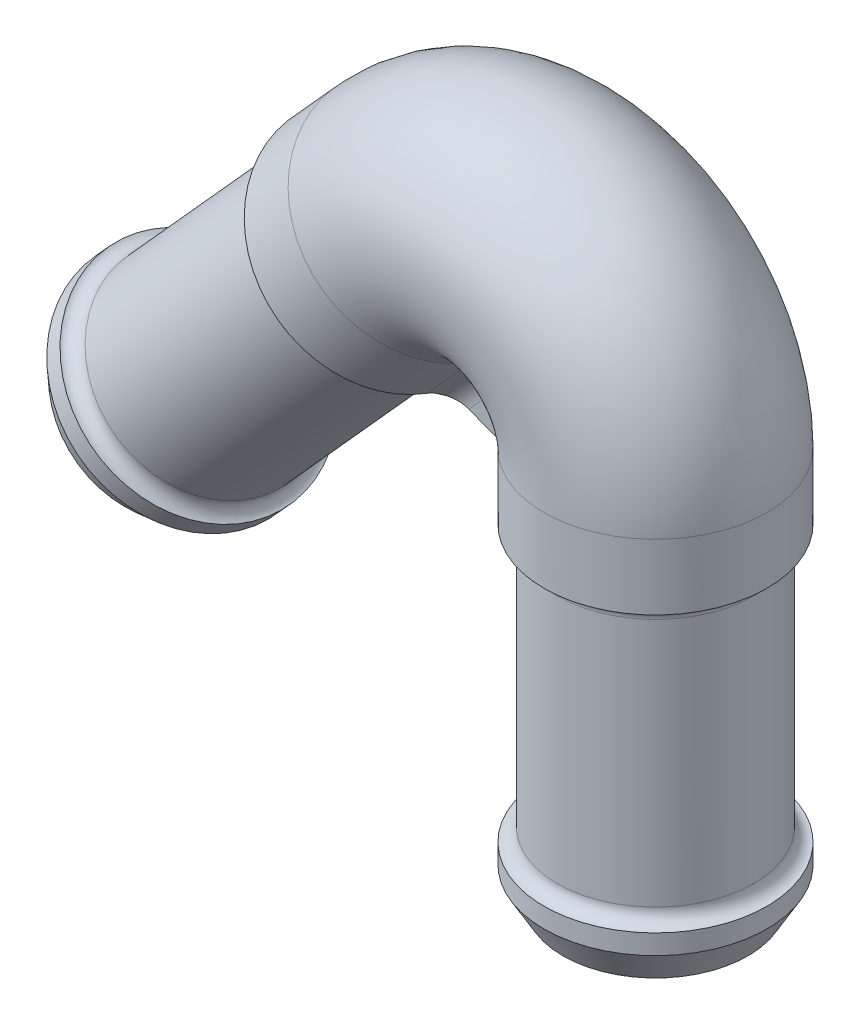
ISO-10303-21;
HEADER;
FILE_DESCRIPTION(('STEP AP214'),'2;1');
FILE_NAME('part.step','',(''),(''),'','','');
FILE_SCHEMA(('AUTOMOTIVE_DESIGN { 1 0 10303 214 1 1 1 1 }'));
ENDSEC;
DATA;
#1=APPLICATION_CONTEXT('core data for automotive mechanical design processes');
#2=APPLICATION_PROTOCOL_DEFINITION('international standard','automotive_design',2000,#1);
#3=PRODUCT_CONTEXT('',#1,'mechanical');
#4=PRODUCT('Part','Part','',(#3));
#5=PRODUCT_RELATED_PRODUCT_CATEGORY('part','',(#4));
#6=PRODUCT_DEFINITION_FORMATION('','',#4);
#7=PRODUCT_DEFINITION_CONTEXT('part definition',#1,'design');
#8=PRODUCT_DEFINITION('design','',#6,#7);
#9=PRODUCT_DEFINITION_SHAPE('','',#8);
#10=(LENGTH_UNIT() NAMED_UNIT(*) SI_UNIT(.MILLI.,.METRE.));
#11=(NAMED_UNIT(*) PLANE_ANGLE_UNIT() SI_UNIT($,.RADIAN.));
#12=(NAMED_UNIT(*) SI_UNIT($,.STERADIAN.) SOLID_ANGLE_UNIT());
#13=UNCERTAINTY_MEASURE_WITH_UNIT(LENGTH_MEASURE(1.E-05),#10,'distance_accuracy_value','');
#14=(GEOMETRIC_REPRESENTATION_CONTEXT(3) GLOBAL_UNCERTAINTY_ASSIGNED_CONTEXT((#13)) GLOBAL_UNIT_ASSIGNED_CONTEXT((#10,
#11,#12)) REPRESENTATION_CONTEXT('',''));
#15=CARTESIAN_POINT('',(0.,0.,0.));
#16=DIRECTION('',(0.,0.,1.));
#17=DIRECTION('',(1.,0.,0.));
#18=AXIS2_PLACEMENT_3D('',#15,#16,#17);
#19=CARTESIAN_POINT('',(0.,31.75,0.));
#20=DIRECTION('',(0.,1.,0.));
#21=DIRECTION('',(0.,0.,1.));
#22=AXIS2_PLACEMENT_3D('',#19,#20,#21);
#23=PLANE('',#22);
#24=DIRECTION('',(0.,0.,-1.));
#25=VECTOR('',#24,1.);
#26=CARTESIAN_POINT('',(-10.795,31.75,1.5875));
#27=LINE('',#26,#25);
#28=CARTESIAN_POINT('',(-10.795,31.75,0.));
#29=VERTEX_POINT('',#28);
#30=CARTESIAN_POINT('',(-10.795,31.75,-2.42519437078922));
#31=VERTEX_POINT('',#30);
#32=EDGE_CURVE('E248',#29,#31,#27,.T.);
#33=ORIENTED_EDGE('',*,*,#32,.T.);
#34=CARTESIAN_POINT('',(-12.6801407227996,31.75,-4.1275));
#35=DIRECTION('',(0.,1.,0.));
#36=DIRECTION('',(0.,0.,1.));
#37=AXIS2_PLACEMENT_3D('',#34,#35,#36);
#38=CIRCLE('',#37,2.54);
#39=CARTESIAN_POINT('',(-10.2648758232187,31.75,-3.34130952380952));
#40=VERTEX_POINT('',#39);
#41=EDGE_CURVE('E187',#31,#40,#38,.T.);
#42=ORIENTED_EDGE('',*,*,#41,.T.);
#43=CARTESIAN_POINT('',(0.,31.75,0.));
#44=DIRECTION('',(0.,1.,0.));
#45=DIRECTION('',(0.,0.,1.));
#46=AXIS2_PLACEMENT_3D('',#43,#44,#45);
#47=CIRCLE('',#46,10.795);
#48=EDGE_CURVE('E246',#40,#29,#47,.T.);
#49=ORIENTED_EDGE('',*,*,#48,.T.);
#50=EDGE_LOOP('',(#33,#42,#49));
#51=FACE_BOUND('',#50,.T.);
#52=ADVANCED_FACE('F77',(#51),#23,.F.);
#53=CARTESIAN_POINT('',(-26.3869186339417,41.8789890589761,0.));
#54=DIRECTION('',(-0.66913060635886,-0.743144825477392,0.));
#55=DIRECTION('',(0.,0.,1.));
#56=AXIS2_PLACEMENT_3D('',#53,#54,#55);
#57=PLANE('',#56);
#58=DIRECTION('',(0.,0.,-1.));
#59=VECTOR('',#58,1.);
#60=CARTESIAN_POINT('',(-18.3646702429132,34.6557241633322,1.5875));
#61=LINE('',#60,#59);
#62=CARTESIAN_POINT('',(-18.3646702429132,34.6557241633322,0.));
#63=VERTEX_POINT('',#62);
#64=CARTESIAN_POINT('',(-18.3646702429132,34.6557241633322,-2.4251943707892));
#65=VERTEX_POINT('',#64);
#66=EDGE_CURVE('E170',#63,#65,#61,.T.);
#67=ORIENTED_EDGE('',*,*,#66,.F.);
#68=CARTESIAN_POINT('',(-26.3869186339416,41.8789890589761,0.));
#69=DIRECTION('',(-0.66913060635886,-0.743144825477392,0.));
#70=DIRECTION('',(0.743144825477392,-0.66913060635886,0.));
#71=AXIS2_PLACEMENT_3D('',#68,#69,#70);
#72=CIRCLE('',#71,10.795);
#73=CARTESIAN_POINT('',(-18.7586292817487,35.0104464751873,-3.34130952380953));
#74=VERTEX_POINT('',#73);
#75=EDGE_CURVE('E183',#63,#74,#72,.F.);
#76=ORIENTED_EDGE('',*,*,#75,.T.);
#77=CARTESIAN_POINT('',(-16.963737669468,33.3943188084135,-4.12750000000001));
#78=DIRECTION('',(-0.66913060635886,-0.743144825477392,0.));
#79=DIRECTION('',(0.743144825477392,-0.66913060635886,0.));
#80=AXIS2_PLACEMENT_3D('',#77,#78,#79);
#81=CIRCLE('',#80,2.54);
#82=EDGE_CURVE('E181',#74,#65,#81,.F.);
#83=ORIENTED_EDGE('',*,*,#82,.T.);
#84=EDGE_LOOP('',(#67,#76,#83));
#85=FACE_BOUND('',#84,.T.);
#86=ADVANCED_FACE('F182',(#85),#57,.T.);
#87=CARTESIAN_POINT('',(0.,0.,0.));
#88=DIRECTION('',(0.,1.,0.));
#89=DIRECTION('',(0.,0.,1.));
#90=AXIS2_PLACEMENT_3D('',#87,#88,#89);
#91=CYLINDRICAL_SURFACE('',#90,9.525);
#92=CARTESIAN_POINT('',(0.,30.48,0.));
#93=DIRECTION('',(0.,1.,0.));
#94=DIRECTION('',(0.,0.,1.));
#95=AXIS2_PLACEMENT_3D('',#92,#93,#94);
#96=CIRCLE('',#95,9.525);
#97=CARTESIAN_POINT('',(0.,30.48,9.525));
#98=VERTEX_POINT('',#97);
#99=EDGE_CURVE('E306',#98,#98,#96,.F.);
#100=ORIENTED_EDGE('',*,*,#99,.T.);
#101=EDGE_LOOP('',(#100));
#102=FACE_BOUND('',#101,.T.);
#103=CARTESIAN_POINT('',(0.,6.35,0.));
#104=DIRECTION('',(0.,-1.,0.));
#105=DIRECTION('',(0.,0.,-1.));
#106=AXIS2_PLACEMENT_3D('',#103,#104,#105);
#107=CIRCLE('',#106,9.525);
#108=CARTESIAN_POINT('',(0.,6.35,-9.525));
#109=VERTEX_POINT('',#108);
#110=EDGE_CURVE('E295',#109,#109,#107,.F.);
#111=ORIENTED_EDGE('',*,*,#110,.T.);
#112=EDGE_LOOP('',(#111));
#113=FACE_BOUND('',#112,.T.);
#114=ADVANCED_FACE('F311',(#102,#113),#91,.T.);
#115=CARTESIAN_POINT('',(-22.1379392835629,46.5979587007575,0.));
#116=DIRECTION('',(-0.669130606358859,-0.743144825477393,0.));
#117=DIRECTION('',(0.743144825477393,-0.669130606358859,0.));
#118=AXIS2_PLACEMENT_3D('',#115,#116,#117);
#119=CYLINDRICAL_SURFACE('',#118,9.525);
#120=CARTESIAN_POINT('',(-27.2367145040174,40.9351951306198,0.));
#121=DIRECTION('',(-0.66913060635886,-0.743144825477392,0.));
#122=DIRECTION('',(0.743144825477392,-0.66913060635886,0.));
#123=AXIS2_PLACEMENT_3D('',#120,#121,#122);
#124=CIRCLE('',#123,9.525);
#125=CARTESIAN_POINT('',(-20.1582600413452,34.5617261050516,0.));
#126=VERTEX_POINT('',#125);
#127=EDGE_CURVE('E303',#126,#126,#124,.T.);
#128=ORIENTED_EDGE('',*,*,#127,.T.);
#129=EDGE_LOOP('',(#128));
#130=FACE_BOUND('',#129,.T.);
#131=CARTESIAN_POINT('',(-43.3828360354567,23.0031104918503,0.));
#132=DIRECTION('',(-0.669130606358859,-0.743144825477393,0.));
#133=DIRECTION('',(0.743144825477393,-0.669130606358859,0.));
#134=AXIS2_PLACEMENT_3D('',#131,#132,#133);
#135=CIRCLE('',#134,9.525);
#136=CARTESIAN_POINT('',(-36.3043815727845,16.6296414662821,0.));
#137=VERTEX_POINT('',#136);
#138=EDGE_CURVE('E298',#137,#137,#135,.F.);
#139=ORIENTED_EDGE('',*,*,#138,.T.);
#140=EDGE_LOOP('',(#139));
#141=FACE_BOUND('',#140,.T.);
#142=ADVANCED_FACE('F344',(#130,#141),#119,.T.);
#143=CARTESIAN_POINT('',(0.,0.,0.));
#144=DIRECTION('',(0.,1.,0.));
#145=DIRECTION('',(0.,0.,1.));
#146=AXIS2_PLACEMENT_3D('',#143,#144,#145);
#147=PLANE('',#146);
#148=CARTESIAN_POINT('',(0.,0.,0.));
#149=DIRECTION('',(0.,1.,0.));
#150=DIRECTION('',(0.,0.,1.));
#151=AXIS2_PLACEMENT_3D('',#148,#149,#150);
#152=CIRCLE('',#151,8.96191289532294);
#153=CARTESIAN_POINT('',(0.,0.,8.96191289532294));
#154=VERTEX_POINT('',#153);
#155=EDGE_CURVE('E278',#154,#154,#152,.F.);
#156=ORIENTED_EDGE('',*,*,#155,.T.);
#157=EDGE_LOOP('',(#156));
#158=FACE_BOUND('',#157,.T.);
#159=CARTESIAN_POINT('',(0.,0.,0.));
#160=DIRECTION('',(0.,1.,0.));
#161=DIRECTION('',(0.,0.,1.));
#162=AXIS2_PLACEMENT_3D('',#159,#160,#161);
#163=CIRCLE('',#162,7.9375);
#164=CARTESIAN_POINT('',(0.,0.,7.9375));
#165=VERTEX_POINT('',#164);
#166=EDGE_CURVE('E401',#165,#165,#163,.F.);
#167=ORIENTED_EDGE('',*,*,#166,.F.);
#168=EDGE_LOOP('',(#167));
#169=FACE_BOUND('',#168,.T.);
#170=ADVANCED_FACE('F337',(#158,#169),#147,.F.);
#171=CARTESIAN_POINT('',(-10.795,31.75,2.42519437078922));
#172=VERTEX_POINT('',#171);
#173=EDGE_CURVE('E409',#172,#29,#27,.T.);
#174=ORIENTED_EDGE('',*,*,#173,.T.);
#175=CARTESIAN_POINT('',(0.,31.75,0.));
#176=DIRECTION('',(0.,1.,0.));
#177=DIRECTION('',(0.,0.,1.));
#178=AXIS2_PLACEMENT_3D('',#175,#176,#177);
#179=CIRCLE('',#178,10.795);
#180=CARTESIAN_POINT('',(-10.2648758232187,31.75,3.34130952380952));
#181=VERTEX_POINT('',#180);
#182=EDGE_CURVE('E124',#29,#181,#179,.T.);
#183=ORIENTED_EDGE('',*,*,#182,.T.);
#184=CARTESIAN_POINT('',(-12.6801407227996,31.75,4.1275));
#185=DIRECTION('',(0.,1.,0.));
#186=DIRECTION('',(0.,0.,1.));
#187=AXIS2_PLACEMENT_3D('',#184,#185,#186);
#188=CIRCLE('',#187,2.54);
#189=EDGE_CURVE('E193',#181,#172,#188,.T.);
#190=ORIENTED_EDGE('',*,*,#189,.T.);
#191=EDGE_LOOP('',(#174,#183,#190));
#192=FACE_BOUND('',#191,.T.);
#193=ADVANCED_FACE('F329',(#192),#23,.F.);
#194=CARTESIAN_POINT('',(-18.3646702429132,34.6557241633322,2.42519437078923));
#195=VERTEX_POINT('',#194);
#196=EDGE_CURVE('E101',#195,#63,#61,.T.);
#197=ORIENTED_EDGE('',*,*,#196,.F.);
#198=CARTESIAN_POINT('',(-16.963737669468,33.3943188084135,4.12749999999999));
#199=DIRECTION('',(-0.66913060635886,-0.743144825477392,0.));
#200=DIRECTION('',(0.743144825477392,-0.66913060635886,0.));
#201=AXIS2_PLACEMENT_3D('',#198,#199,#200);
#202=CIRCLE('',#201,2.54);
#203=CARTESIAN_POINT('',(-18.7586292817487,35.0104464751873,3.34130952380952));
#204=VERTEX_POINT('',#203);
#205=EDGE_CURVE('E12',#195,#204,#202,.F.);
#206=ORIENTED_EDGE('',*,*,#205,.T.);
#207=CARTESIAN_POINT('',(-26.3869186339416,41.8789890589761,0.));
#208=DIRECTION('',(-0.66913060635886,-0.743144825477392,0.));
#209=DIRECTION('',(0.743144825477392,-0.66913060635886,0.));
#210=AXIS2_PLACEMENT_3D('',#207,#208,#209);
#211=CIRCLE('',#210,10.795);
#212=EDGE_CURVE('E94',#204,#63,#211,.F.);
#213=ORIENTED_EDGE('',*,*,#212,.T.);
#214=EDGE_LOOP('',(#197,#206,#213));
#215=FACE_BOUND('',#214,.T.);
#216=ADVANCED_FACE('F334',(#215),#57,.T.);
#217=CARTESIAN_POINT('',(0.,31.75,0.));
#218=DIRECTION('',(0.,1.,0.));
#219=DIRECTION('',(0.,0.,1.));
#220=AXIS2_PLACEMENT_3D('',#217,#218,#219);
#221=CYLINDRICAL_SURFACE('',#220,10.795);
#222=CARTESIAN_POINT('',(0.,31.75,0.));
#223=DIRECTION('',(0.,1.,0.));
#224=DIRECTION('',(0.,0.,1.));
#225=AXIS2_PLACEMENT_3D('',#222,#223,#224);
#226=CIRCLE('',#225,10.795);
#227=EDGE_CURVE('E411',#181,#40,#226,.T.);
#228=ORIENTED_EDGE('',*,*,#227,.T.);
#229=DIRECTION('',(0.,1.,0.));
#230=VECTOR('',#229,1.);
#231=CARTESIAN_POINT('',(-10.2648758232187,31.75,-3.34130952380952));
#232=LINE('',#231,#230);
#233=CARTESIAN_POINT('',(-10.2648758232187,38.1,-3.34130952380952));
#234=VERTEX_POINT('',#233);
#235=EDGE_CURVE('E252',#40,#234,#232,.T.);
#236=ORIENTED_EDGE('',*,*,#235,.T.);
#237=CARTESIAN_POINT('',(0.,38.1,0.));
#238=DIRECTION('',(0.,1.,0.));
#239=DIRECTION('',(0.,0.,1.));
#240=AXIS2_PLACEMENT_3D('',#237,#238,#239);
#241=CIRCLE('',#240,10.795);
#242=CARTESIAN_POINT('',(-10.2648758232187,38.1,3.34130952380952));
#243=VERTEX_POINT('',#242);
#244=EDGE_CURVE('E283',#243,#234,#241,.T.);
#245=ORIENTED_EDGE('',*,*,#244,.F.);
#246=DIRECTION('',(0.,1.,0.));
#247=VECTOR('',#246,1.);
#248=CARTESIAN_POINT('',(-10.2648758232187,31.75,3.34130952380952));
#249=LINE('',#248,#247);
#250=EDGE_CURVE('E262',#243,#181,#249,.F.);
#251=ORIENTED_EDGE('',*,*,#250,.T.);
#252=EDGE_LOOP('',(#228,#236,#245,#251));
#253=FACE_BOUND('',#252,.T.);
#254=ADVANCED_FACE('F343',(#253),#221,.T.);
#255=CARTESIAN_POINT('',(-12.7,38.1,0.));
#256=DIRECTION('',(0.,0.,1.));
#257=DIRECTION('',(1.,0.,0.));
#258=AXIS2_PLACEMENT_3D('',#255,#256,#257);
#259=TOROIDAL_SURFACE('',#258,12.7,10.795);
#260=ORIENTED_EDGE('',*,*,#244,.T.);
#261=CARTESIAN_POINT('',(-12.7,38.1,-3.34130952380952));
#262=DIRECTION('',(0.,0.,1.));
#263=DIRECTION('',(1.,0.,0.));
#264=AXIS2_PLACEMENT_3D('',#261,#262,#263);
#265=CIRCLE('',#264,2.4351241767813);
#266=CARTESIAN_POINT('',(-14.5096499313699,39.7294161169688,-3.34130952380952));
#267=VERTEX_POINT('',#266);
#268=EDGE_CURVE('E238',#234,#267,#265,.T.);
#269=ORIENTED_EDGE('',*,*,#268,.T.);
#270=CARTESIAN_POINT('',(-22.1379392835629,46.5979587007575,0.));
#271=DIRECTION('',(-0.669130606358859,-0.743144825477393,0.));
#272=DIRECTION('',(0.,0.,1.));
#273=AXIS2_PLACEMENT_3D('',#270,#271,#272);
#274=CIRCLE('',#273,10.795);
#275=CARTESIAN_POINT('',(-14.5096499313699,39.7294161169688,3.34130952380952));
#276=VERTEX_POINT('',#275);
#277=EDGE_CURVE('E276',#276,#267,#274,.T.);
#278=ORIENTED_EDGE('',*,*,#277,.F.);
#279=CARTESIAN_POINT('',(-12.7,38.1,3.34130952380952));
#280=DIRECTION('',(0.,0.,-1.));
#281=DIRECTION('',(-1.,0.,0.));
#282=AXIS2_PLACEMENT_3D('',#279,#280,#281);
#283=CIRCLE('',#282,2.4351241767813);
#284=EDGE_CURVE('E219',#276,#243,#283,.T.);
#285=ORIENTED_EDGE('',*,*,#284,.T.);
#286=EDGE_LOOP('',(#260,#269,#278,#285));
#287=FACE_BOUND('',#286,.T.);
#288=ADVANCED_FACE('F356',(#287),#259,.T.);
#289=CARTESIAN_POINT('',(-22.1379392835629,46.5979587007575,0.));
#290=DIRECTION('',(-0.66913060635886,-0.743144825477392,0.));
#291=DIRECTION('',(0.743144825477392,-0.66913060635886,0.));
#292=AXIS2_PLACEMENT_3D('',#289,#290,#291);
#293=CYLINDRICAL_SURFACE('',#292,10.795);
#294=ORIENTED_EDGE('',*,*,#277,.T.);
#295=DIRECTION('',(-0.66913060635886,-0.743144825477392,0.));
#296=VECTOR('',#295,1.);
#297=CARTESIAN_POINT('',(-14.5096499313699,39.7294161169688,-3.34130952380952));
#298=LINE('',#297,#296);
#299=EDGE_CURVE('E233',#267,#74,#298,.T.);
#300=ORIENTED_EDGE('',*,*,#299,.T.);
#301=CARTESIAN_POINT('',(-26.3869186339417,41.8789890589761,0.));
#302=DIRECTION('',(-0.66913060635886,-0.743144825477392,0.));
#303=DIRECTION('',(0.,0.,1.));
#304=AXIS2_PLACEMENT_3D('',#301,#302,#303);
#305=CIRCLE('',#304,10.795);
#306=EDGE_CURVE('E274',#204,#74,#305,.T.);
#307=ORIENTED_EDGE('',*,*,#306,.F.);
#308=DIRECTION('',(-0.66913060635886,-0.743144825477392,0.));
#309=VECTOR('',#308,1.);
#310=CARTESIAN_POINT('',(-14.5096499313699,39.7294161169688,3.34130952380953));
#311=LINE('',#310,#309);
#312=EDGE_CURVE('E225',#204,#276,#311,.F.);
#313=ORIENTED_EDGE('',*,*,#312,.T.);
#314=EDGE_LOOP('',(#294,#300,#307,#313));
#315=FACE_BOUND('',#314,.T.);
#316=ADVANCED_FACE('F273',(#315),#293,.T.);
#317=CARTESIAN_POINT('',(-47.6318153858354,18.2841408500688,0.));
#318=DIRECTION('',(-0.669130606358859,-0.743144825477393,0.));
#319=DIRECTION('',(0.,0.,1.));
#320=AXIS2_PLACEMENT_3D('',#317,#318,#319);
#321=PLANE('',#320);
#322=CARTESIAN_POINT('',(-47.6318153858354,18.2841408500688,0.));
#323=DIRECTION('',(-0.669130606358859,-0.743144825477393,0.));
#324=DIRECTION('',(0.743144825477393,-0.669130606358859,0.));
#325=AXIS2_PLACEMENT_3D('',#322,#323,#324);
#326=CIRCLE('',#325,8.9619128953229);
#327=CARTESIAN_POINT('',(-40.9718161912971,12.2874506402861,0.));
#328=VERTEX_POINT('',#327);
#329=EDGE_CURVE('E289',#328,#328,#326,.T.);
#330=ORIENTED_EDGE('',*,*,#329,.T.);
#331=EDGE_LOOP('',(#330));
#332=FACE_BOUND('',#331,.T.);
#333=CARTESIAN_POINT('',(-47.6318153858353,18.2841408500687,0.));
#334=DIRECTION('',(-0.669130606358859,-0.743144825477393,0.));
#335=DIRECTION('',(0.743144825477393,-0.669130606358859,0.));
#336=AXIS2_PLACEMENT_3D('',#333,#334,#335);
#337=CIRCLE('',#336,7.9375);
#338=CARTESIAN_POINT('',(-41.7331033336085,12.9729166620953,0.));
#339=VERTEX_POINT('',#338);
#340=EDGE_CURVE('E390',#339,#339,#337,.F.);
#341=ORIENTED_EDGE('',*,*,#340,.T.);
#342=EDGE_LOOP('',(#341));
#343=FACE_BOUND('',#342,.T.);
#344=ADVANCED_FACE('F338',(#332,#343),#321,.T.);
#345=CARTESIAN_POINT('',(9.23607257146111,24.0607916566317,1.5875));
#346=DIRECTION('',(0.3583679495453,0.933580426497202,0.));
#347=DIRECTION('',(-0.933580426497202,0.3583679495453,0.));
#348=AXIS2_PLACEMENT_3D('',#345,#346,#347);
#349=PLANE('',#348);
#350=ORIENTED_EDGE('',*,*,#66,.T.);
#351=CARTESIAN_POINT('',(-16.4795295201137,33.9320864388688,-4.12750000000001));
#352=DIRECTION('',(0.3583679495453,0.933580426497202,0.));
#353=DIRECTION('',(-0.933580426497202,0.3583679495453,0.));
#354=AXIS2_PLACEMENT_3D('',#351,#352,#353);
#355=ELLIPSE('',#354,2.72070828383806,2.54);
#356=CARTESIAN_POINT('',(-16.4795295201137,33.9320864388688,-1.5875));
#357=VERTEX_POINT('',#356);
#358=EDGE_CURVE('E175',#65,#357,#355,.T.);
#359=ORIENTED_EDGE('',*,*,#358,.T.);
#360=DIRECTION('',(0.933580426497202,-0.3583679495453,0.));
#361=VECTOR('',#360,1.);
#362=CARTESIAN_POINT('',(9.23607257146111,24.0607916566317,-1.5875));
#363=LINE('',#362,#361);
#364=CARTESIAN_POINT('',(-12.6801407227996,32.4736377244634,-1.5875));
#365=VERTEX_POINT('',#364);
#366=EDGE_CURVE('E406',#357,#365,#363,.T.);
#367=ORIENTED_EDGE('',*,*,#366,.T.);
#368=CARTESIAN_POINT('',(-12.6801407227996,32.4736377244634,-4.1275));
#369=DIRECTION('',(0.3583679495453,0.933580426497202,0.));
#370=DIRECTION('',(-0.933580426497202,0.3583679495453,0.));
#371=AXIS2_PLACEMENT_3D('',#368,#369,#370);
#372=ELLIPSE('',#371,2.72070828383805,2.54);
#373=EDGE_CURVE('E240',#365,#31,#372,.T.);
#374=ORIENTED_EDGE('',*,*,#373,.T.);
#375=ORIENTED_EDGE('',*,*,#32,.F.);
#376=ORIENTED_EDGE('',*,*,#173,.F.);
#377=CARTESIAN_POINT('',(-12.6801407227996,32.4736377244634,4.1275));
#378=DIRECTION('',(0.3583679495453,0.933580426497202,0.));
#379=DIRECTION('',(-0.933580426497202,0.3583679495453,0.));
#380=AXIS2_PLACEMENT_3D('',#377,#378,#379);
#381=ELLIPSE('',#380,2.72070828383805,2.54);
#382=CARTESIAN_POINT('',(-12.6801407227996,32.4736377244634,1.5875));
#383=VERTEX_POINT('',#382);
#384=EDGE_CURVE('E195',#172,#383,#381,.T.);
#385=ORIENTED_EDGE('',*,*,#384,.T.);
#386=DIRECTION('',(0.933580426497202,-0.3583679495453,0.));
#387=VECTOR('',#386,1.);
#388=CARTESIAN_POINT('',(9.23607257146111,24.0607916566317,1.5875));
#389=LINE('',#388,#387);
#390=CARTESIAN_POINT('',(-16.4795295201136,33.9320864388688,1.5875));
#391=VERTEX_POINT('',#390);
#392=EDGE_CURVE('E178',#391,#383,#389,.T.);
#393=ORIENTED_EDGE('',*,*,#392,.F.);
#394=CARTESIAN_POINT('',(-16.4795295201136,33.9320864388688,4.12749999999999));
#395=DIRECTION('',(0.3583679495453,0.933580426497202,0.));
#396=DIRECTION('',(-0.933580426497202,0.3583679495453,0.));
#397=AXIS2_PLACEMENT_3D('',#394,#395,#396);
#398=ELLIPSE('',#397,2.72070828383806,2.54);
#399=EDGE_CURVE('E86',#391,#195,#398,.T.);
#400=ORIENTED_EDGE('',*,*,#399,.T.);
#401=ORIENTED_EDGE('',*,*,#196,.T.);
#402=EDGE_LOOP('',(#350,#359,#367,#374,#375,#376,#385,#393,#400,#401));
#403=FACE_BOUND('',#402,.T.);
#404=ADVANCED_FACE('F172',(#403),#349,.F.);
#405=CARTESIAN_POINT('',(0.,0.,1.5875));
#406=DIRECTION('',(0.,0.,1.));
#407=DIRECTION('',(1.,0.,0.));
#408=AXIS2_PLACEMENT_3D('',#405,#406,#407);
#409=PLANE('',#408);
#410=ORIENTED_EDGE('',*,*,#392,.T.);
#411=DIRECTION('',(0.,-1.,0.));
#412=VECTOR('',#411,1.);
#413=CARTESIAN_POINT('',(-12.6801407227996,38.1,1.5875));
#414=LINE('',#413,#412);
#415=CARTESIAN_POINT('',(-12.6801407227996,38.1,1.5875));
#416=VERTEX_POINT('',#415);
#417=EDGE_CURVE('E230',#383,#416,#414,.F.);
#418=ORIENTED_EDGE('',*,*,#417,.T.);
#419=CARTESIAN_POINT('',(-12.7,38.1,1.5875));
#420=DIRECTION('',(0.,0.,1.));
#421=DIRECTION('',(1.,0.,0.));
#422=AXIS2_PLACEMENT_3D('',#419,#420,#421);
#423=CIRCLE('',#422,0.0198592772004298);
#424=CARTESIAN_POINT('',(-12.7147583190892,38.113288450195,1.5875));
#425=VERTEX_POINT('',#424);
#426=EDGE_CURVE('E217',#416,#425,#423,.T.);
#427=ORIENTED_EDGE('',*,*,#426,.T.);
#428=DIRECTION('',(0.66913060635886,0.743144825477392,0.));
#429=VECTOR('',#428,1.);
#430=CARTESIAN_POINT('',(-16.963737669468,33.3943188084135,1.5875));
#431=LINE('',#430,#429);
#432=EDGE_CURVE('E226',#425,#391,#431,.F.);
#433=ORIENTED_EDGE('',*,*,#432,.T.);
#434=EDGE_LOOP('',(#410,#418,#427,#433));
#435=FACE_BOUND('',#434,.T.);
#436=ADVANCED_FACE('F354',(#435),#409,.T.);
#437=CARTESIAN_POINT('',(0.,0.,-1.5875));
#438=DIRECTION('',(0.,0.,1.));
#439=DIRECTION('',(1.,0.,0.));
#440=AXIS2_PLACEMENT_3D('',#437,#438,#439);
#441=PLANE('',#440);
#442=CARTESIAN_POINT('',(-12.7,38.1,-1.5875));
#443=DIRECTION('',(0.,0.,1.));
#444=DIRECTION('',(1.,0.,0.));
#445=AXIS2_PLACEMENT_3D('',#442,#443,#444);
#446=CIRCLE('',#445,0.0198592772004298);
#447=CARTESIAN_POINT('',(-12.7147583190892,38.113288450195,-1.5875));
#448=VERTEX_POINT('',#447);
#449=CARTESIAN_POINT('',(-12.6801407227996,38.1,-1.5875));
#450=VERTEX_POINT('',#449);
#451=EDGE_CURVE('E261',#448,#450,#446,.F.);
#452=ORIENTED_EDGE('',*,*,#451,.T.);
#453=DIRECTION('',(0.,1.,0.));
#454=VECTOR('',#453,1.);
#455=CARTESIAN_POINT('',(-12.6801407227996,0.,-1.5875));
#456=LINE('',#455,#454);
#457=EDGE_CURVE('E269',#450,#365,#456,.F.);
#458=ORIENTED_EDGE('',*,*,#457,.T.);
#459=ORIENTED_EDGE('',*,*,#366,.F.);
#460=DIRECTION('',(-0.66913060635886,-0.743144825477392,0.));
#461=VECTOR('',#460,1.);
#462=CARTESIAN_POINT('',(-25.9741561676044,23.3872352605348,-1.5875));
#463=LINE('',#462,#461);
#464=EDGE_CURVE('E192',#357,#448,#463,.F.);
#465=ORIENTED_EDGE('',*,*,#464,.T.);
#466=EDGE_LOOP('',(#452,#458,#459,#465));
#467=FACE_BOUND('',#466,.T.);
#468=ADVANCED_FACE('F419',(#467),#441,.F.);
#469=CARTESIAN_POINT('',(-48.3009459921943,17.5409960245912,0.));
#470=DIRECTION('',(0.669130606358859,0.743144825477393,0.));
#471=DIRECTION('',(-0.743144825477393,0.669130606358859,0.));
#472=AXIS2_PLACEMENT_3D('',#469,#470,#471);
#473=CYLINDRICAL_SURFACE('',#472,7.9375);
#474=CARTESIAN_POINT('',(-22.137939283563,46.5979587007572,0.));
#475=DIRECTION('',(0.669130606358859,0.743144825477393,0.));
#476=DIRECTION('',(-0.743144825477393,0.669130606358859,0.));
#477=AXIS2_PLACEMENT_3D('',#474,#475,#476);
#478=CIRCLE('',#477,7.9375);
#479=CARTESIAN_POINT('',(-28.0366513357899,51.9091828887306,0.));
#480=VERTEX_POINT('',#479);
#481=EDGE_CURVE('E393',#480,#480,#478,.T.);
#482=ORIENTED_EDGE('',*,*,#481,.T.);
#483=EDGE_LOOP('',(#482));
#484=FACE_BOUND('',#483,.T.);
#485=ORIENTED_EDGE('',*,*,#340,.F.);
#486=EDGE_LOOP('',(#485));
#487=FACE_BOUND('',#486,.T.);
#488=ADVANCED_FACE('F421',(#484,#487),#473,.F.);
#489=CARTESIAN_POINT('',(-12.7,38.1,0.));
#490=DIRECTION('',(0.,0.,-1.));
#491=DIRECTION('',(-1.,0.,0.));
#492=AXIS2_PLACEMENT_3D('',#489,#490,#491);
#493=TOROIDAL_SURFACE('',#492,12.6999999999999,7.9375);
#494=CARTESIAN_POINT('',(0.,38.1,0.));
#495=DIRECTION('',(0.,-1.,0.));
#496=DIRECTION('',(1.,0.,0.));
#497=AXIS2_PLACEMENT_3D('',#494,#495,#496);
#498=CIRCLE('',#497,7.9375);
#499=CARTESIAN_POINT('',(7.93749999999989,38.1,0.));
#500=VERTEX_POINT('',#499);
#501=EDGE_CURVE('E398',#500,#500,#498,.T.);
#502=CARTESIAN_POINT('',(-12.7,38.1,0.));
#503=DIRECTION('',(0.,0.,-1.));
#504=DIRECTION('',(-1.,0.,0.));
#505=AXIS2_PLACEMENT_3D('',#502,#503,#504);
#506=CIRCLE('',#505,20.6374999999999);
#507=EDGE_CURVE('',#480,#500,#506,.T.);
#508=ORIENTED_EDGE('',*,*,#481,.F.);
#509=ORIENTED_EDGE('',*,*,#501,.T.);
#510=ORIENTED_EDGE('',*,*,#507,.T.);
#511=ORIENTED_EDGE('',*,*,#507,.F.);
#512=EDGE_LOOP('',(#508,#510,#509,#511));
#513=FACE_BOUND('',#512,.T.);
#514=ADVANCED_FACE('F427',(#513),#493,.F.);
#515=CARTESIAN_POINT('',(0.,38.1,0.));
#516=DIRECTION('',(0.,-1.,0.));
#517=DIRECTION('',(0.,0.,-1.));
#518=AXIS2_PLACEMENT_3D('',#515,#516,#517);
#519=CYLINDRICAL_SURFACE('',#518,7.9375);
#520=ORIENTED_EDGE('',*,*,#166,.T.);
#521=EDGE_LOOP('',(#520));
#522=FACE_BOUND('',#521,.T.);
#523=ORIENTED_EDGE('',*,*,#501,.F.);
#524=EDGE_LOOP('',(#523));
#525=FACE_BOUND('',#524,.T.);
#526=ADVANCED_FACE('F430',(#522,#525),#519,.F.);
#527=CARTESIAN_POINT('',(-44.2326319055324,22.059316563494,0.));
#528=DIRECTION('',(-0.669130606358859,-0.743144825477393,0.));
#529=DIRECTION('',(0.743144825477393,-0.669130606358859,0.));
#530=AXIS2_PLACEMENT_3D('',#527,#528,#529);
#531=CYLINDRICAL_SURFACE('',#530,10.795);
#532=CARTESIAN_POINT('',(-45.507325710646,20.6436256709596,0.));
#533=DIRECTION('',(-0.66913060635886,-0.743144825477393,0.));
#534=DIRECTION('',(0.743144825477393,-0.66913060635886,0.));
#535=AXIS2_PLACEMENT_3D('',#532,#533,#534);
#536=CIRCLE('',#535,10.795);
#537=CARTESIAN_POINT('',(-37.4850773196176,13.4203607753157,0.));
#538=VERTEX_POINT('',#537);
#539=EDGE_CURVE('E292',#538,#538,#536,.F.);
#540=ORIENTED_EDGE('',*,*,#539,.T.);
#541=EDGE_LOOP('',(#540));
#542=FACE_BOUND('',#541,.T.);
#543=CARTESIAN_POINT('',(-44.2326319055324,22.059316563494,0.));
#544=DIRECTION('',(-0.669130606358859,-0.743144825477393,0.));
#545=DIRECTION('',(0.743144825477393,-0.669130606358859,0.));
#546=AXIS2_PLACEMENT_3D('',#543,#544,#545);
#547=CIRCLE('',#546,10.795);
#548=CARTESIAN_POINT('',(-36.210383514504,14.8360516678501,0.));
#549=VERTEX_POINT('',#548);
#550=EDGE_CURVE('E388',#549,#549,#547,.T.);
#551=ORIENTED_EDGE('',*,*,#550,.T.);
#552=EDGE_LOOP('',(#551));
#553=FACE_BOUND('',#552,.T.);
#554=ADVANCED_FACE('F587',(#542,#553),#531,.T.);
#555=CARTESIAN_POINT('',(0.,5.08,0.));
#556=DIRECTION('',(0.,-1.,0.));
#557=DIRECTION('',(0.,0.,-1.));
#558=AXIS2_PLACEMENT_3D('',#555,#556,#557);
#559=CYLINDRICAL_SURFACE('',#558,10.795);
#560=CARTESIAN_POINT('',(0.,3.17500000000003,0.));
#561=DIRECTION('',(0.,1.,0.));
#562=DIRECTION('',(0.,0.,1.));
#563=AXIS2_PLACEMENT_3D('',#560,#561,#562);
#564=CIRCLE('',#563,10.795);
#565=CARTESIAN_POINT('',(0.,3.17500000000003,10.795));
#566=VERTEX_POINT('',#565);
#567=EDGE_CURVE('E281',#566,#566,#564,.T.);
#568=ORIENTED_EDGE('',*,*,#567,.T.);
#569=EDGE_LOOP('',(#568));
#570=FACE_BOUND('',#569,.T.);
#571=CARTESIAN_POINT('',(0.,5.08,0.));
#572=DIRECTION('',(0.,-1.,0.));
#573=DIRECTION('',(0.,0.,-1.));
#574=AXIS2_PLACEMENT_3D('',#571,#572,#573);
#575=CIRCLE('',#574,10.795);
#576=CARTESIAN_POINT('',(0.,5.08,-10.795));
#577=VERTEX_POINT('',#576);
#578=EDGE_CURVE('E205',#577,#577,#575,.T.);
#579=ORIENTED_EDGE('',*,*,#578,.T.);
#580=EDGE_LOOP('',(#579));
#581=FACE_BOUND('',#580,.T.);
#582=ADVANCED_FACE('F369',(#570,#581),#559,.T.);
#583=CARTESIAN_POINT('',(0.,0.,0.));
#584=DIRECTION('',(0.,1.,0.));
#585=DIRECTION('',(0.,0.,1.));
#586=AXIS2_PLACEMENT_3D('',#583,#584,#585);
#587=CONICAL_SURFACE('',#586,8.96191289532294,0.523598775598296);
#588=ORIENTED_EDGE('',*,*,#567,.F.);
#589=EDGE_LOOP('',(#588));
#590=FACE_BOUND('',#589,.T.);
#591=ORIENTED_EDGE('',*,*,#155,.F.);
#592=EDGE_LOOP('',(#591));
#593=FACE_BOUND('',#592,.T.);
#594=ADVANCED_FACE('F362',(#590,#593),#587,.T.);
#595=CARTESIAN_POINT('',(-47.6318153858354,18.2841408500688,0.));
#596=DIRECTION('',(0.66913060635886,0.743144825477393,0.));
#597=DIRECTION('',(-0.743144825477393,0.66913060635886,0.));
#598=AXIS2_PLACEMENT_3D('',#595,#596,#597);
#599=CONICAL_SURFACE('',#598,8.9619128953229,0.523598775598297);
#600=ORIENTED_EDGE('',*,*,#539,.F.);
#601=EDGE_LOOP('',(#600));
#602=FACE_BOUND('',#601,.T.);
#603=ORIENTED_EDGE('',*,*,#329,.F.);
#604=EDGE_LOOP('',(#603));
#605=FACE_BOUND('',#604,.T.);
#606=ADVANCED_FACE('F368',(#602,#605),#599,.T.);
#607=CARTESIAN_POINT('',(0.,6.35,0.));
#608=DIRECTION('',(0.,-1.,0.));
#609=DIRECTION('',(0.,0.,-1.));
#610=AXIS2_PLACEMENT_3D('',#607,#608,#609);
#611=TOROIDAL_SURFACE('',#610,10.795,1.27);
#612=ORIENTED_EDGE('',*,*,#110,.F.);
#613=EDGE_LOOP('',(#612));
#614=FACE_BOUND('',#613,.T.);
#615=ORIENTED_EDGE('',*,*,#578,.F.);
#616=EDGE_LOOP('',(#615));
#617=FACE_BOUND('',#616,.T.);
#618=ADVANCED_FACE('F375',(#614,#617),#611,.F.);
#619=CARTESIAN_POINT('',(-43.3828360354567,23.0031104918503,0.));
#620=DIRECTION('',(-0.669130606358859,-0.743144825477393,0.));
#621=DIRECTION('',(0.743144825477393,-0.669130606358859,0.));
#622=AXIS2_PLACEMENT_3D('',#619,#620,#621);
#623=TOROIDAL_SURFACE('',#622,10.795,1.27);
#624=ORIENTED_EDGE('',*,*,#138,.F.);
#625=EDGE_LOOP('',(#624));
#626=FACE_BOUND('',#625,.T.);
#627=ORIENTED_EDGE('',*,*,#550,.F.);
#628=EDGE_LOOP('',(#627));
#629=FACE_BOUND('',#628,.T.);
#630=ADVANCED_FACE('F323',(#626,#629),#623,.F.);
#631=CARTESIAN_POINT('',(-27.2367145040174,40.9351951306198,0.));
#632=DIRECTION('',(-0.66913060635886,-0.743144825477392,0.));
#633=DIRECTION('',(0.743144825477392,-0.66913060635886,0.));
#634=AXIS2_PLACEMENT_3D('',#631,#632,#633);
#635=TOROIDAL_SURFACE('',#634,10.795,1.27);
#636=ORIENTED_EDGE('',*,*,#127,.F.);
#637=EDGE_LOOP('',(#636));
#638=FACE_BOUND('',#637,.T.);
#639=ORIENTED_EDGE('',*,*,#212,.F.);
#640=ORIENTED_EDGE('',*,*,#306,.T.);
#641=ORIENTED_EDGE('',*,*,#75,.F.);
#642=EDGE_LOOP('',(#639,#640,#641));
#643=FACE_BOUND('',#642,.T.);
#644=ADVANCED_FACE('F277',(#638,#643),#635,.F.);
#645=CARTESIAN_POINT('',(0.,30.48,0.));
#646=DIRECTION('',(0.,1.,0.));
#647=DIRECTION('',(0.,0.,1.));
#648=AXIS2_PLACEMENT_3D('',#645,#646,#647);
#649=TOROIDAL_SURFACE('',#648,10.795,1.27);
#650=ORIENTED_EDGE('',*,*,#182,.F.);
#651=ORIENTED_EDGE('',*,*,#48,.F.);
#652=ORIENTED_EDGE('',*,*,#227,.F.);
#653=EDGE_LOOP('',(#650,#651,#652));
#654=FACE_BOUND('',#653,.T.);
#655=ORIENTED_EDGE('',*,*,#99,.F.);
#656=EDGE_LOOP('',(#655));
#657=FACE_BOUND('',#656,.T.);
#658=ADVANCED_FACE('F314',(#654,#657),#649,.F.);
#659=CARTESIAN_POINT('',(-12.7147583190892,38.113288450195,-4.1275));
#660=DIRECTION('',(-0.66913060635886,-0.743144825477392,0.));
#661=DIRECTION('',(0.743144825477392,-0.66913060635886,0.));
#662=AXIS2_PLACEMENT_3D('',#659,#660,#661);
#663=CYLINDRICAL_SURFACE('',#662,2.54);
#664=ORIENTED_EDGE('',*,*,#82,.F.);
#665=ORIENTED_EDGE('',*,*,#299,.F.);
#666=CARTESIAN_POINT('',(-12.7147583190892,38.113288450195,-4.1275));
#667=DIRECTION('',(-0.66913060635886,-0.743144825477393,0.));
#668=DIRECTION('',(0.743144825477393,-0.66913060635886,0.));
#669=AXIS2_PLACEMENT_3D('',#666,#667,#668);
#670=CIRCLE('',#669,2.54);
#671=EDGE_CURVE('E203',#448,#267,#670,.T.);
#672=ORIENTED_EDGE('',*,*,#671,.F.);
#673=ORIENTED_EDGE('',*,*,#464,.F.);
#674=ORIENTED_EDGE('',*,*,#358,.F.);
#675=EDGE_LOOP('',(#664,#665,#672,#673,#674));
#676=FACE_BOUND('',#675,.T.);
#677=ADVANCED_FACE('F190',(#676),#663,.F.);
#678=CARTESIAN_POINT('',(-12.7,38.1,-4.1275));
#679=DIRECTION('',(0.,0.,-1.));
#680=DIRECTION('',(-1.,0.,0.));
#681=AXIS2_PLACEMENT_3D('',#678,#679,#680);
#682=DEGENERATE_TOROIDAL_SURFACE('',#681,0.0198592772004298,2.54,.T.);
#683=ORIENTED_EDGE('',*,*,#671,.T.);
#684=ORIENTED_EDGE('',*,*,#268,.F.);
#685=CARTESIAN_POINT('',(-12.6801407227996,38.1,-4.1275));
#686=DIRECTION('',(0.,1.,0.));
#687=DIRECTION('',(0.,0.,1.));
#688=AXIS2_PLACEMENT_3D('',#685,#686,#687);
#689=CIRCLE('',#688,2.54);
#690=EDGE_CURVE('E201',#450,#234,#689,.T.);
#691=ORIENTED_EDGE('',*,*,#690,.F.);
#692=ORIENTED_EDGE('',*,*,#451,.F.);
#693=EDGE_LOOP('',(#683,#684,#691,#692));
#694=FACE_BOUND('',#693,.T.);
#695=ADVANCED_FACE('F321',(#694),#682,.F.);
#696=CARTESIAN_POINT('',(-12.6801407227996,31.75,-4.1275));
#697=DIRECTION('',(0.,1.,0.));
#698=DIRECTION('',(0.,0.,1.));
#699=AXIS2_PLACEMENT_3D('',#696,#697,#698);
#700=CYLINDRICAL_SURFACE('',#699,2.54);
#701=ORIENTED_EDGE('',*,*,#373,.F.);
#702=ORIENTED_EDGE('',*,*,#457,.F.);
#703=ORIENTED_EDGE('',*,*,#690,.T.);
#704=ORIENTED_EDGE('',*,*,#235,.F.);
#705=ORIENTED_EDGE('',*,*,#41,.F.);
#706=EDGE_LOOP('',(#701,#702,#703,#704,#705));
#707=FACE_BOUND('',#706,.T.);
#708=ADVANCED_FACE('F253',(#707),#700,.F.);
#709=CARTESIAN_POINT('',(-12.7147583190892,38.113288450195,4.1275));
#710=DIRECTION('',(-0.66913060635886,-0.743144825477392,0.));
#711=DIRECTION('',(0.743144825477392,-0.66913060635886,0.));
#712=AXIS2_PLACEMENT_3D('',#709,#710,#711);
#713=CYLINDRICAL_SURFACE('',#712,2.54);
#714=ORIENTED_EDGE('',*,*,#399,.F.);
#715=ORIENTED_EDGE('',*,*,#432,.F.);
#716=CARTESIAN_POINT('',(-12.7147583190892,38.113288450195,4.1275));
#717=DIRECTION('',(-0.669130606358861,-0.743144825477392,0.));
#718=DIRECTION('',(0.743144825477392,-0.669130606358861,0.));
#719=AXIS2_PLACEMENT_3D('',#716,#717,#718);
#720=CIRCLE('',#719,2.54);
#721=EDGE_CURVE('E81',#276,#425,#720,.T.);
#722=ORIENTED_EDGE('',*,*,#721,.F.);
#723=ORIENTED_EDGE('',*,*,#312,.F.);
#724=ORIENTED_EDGE('',*,*,#205,.F.);
#725=EDGE_LOOP('',(#714,#715,#722,#723,#724));
#726=FACE_BOUND('',#725,.T.);
#727=ADVANCED_FACE('F79',(#726),#713,.F.);
#728=CARTESIAN_POINT('',(-12.7,38.1,4.1275));
#729=DIRECTION('',(0.,0.,-1.));
#730=DIRECTION('',(-1.,0.,0.));
#731=AXIS2_PLACEMENT_3D('',#728,#729,#730);
#732=DEGENERATE_TOROIDAL_SURFACE('',#731,0.0198592772004298,2.54,.T.);
#733=ORIENTED_EDGE('',*,*,#721,.T.);
#734=ORIENTED_EDGE('',*,*,#426,.F.);
#735=CARTESIAN_POINT('',(-12.6801407227996,38.1,4.1275));
#736=DIRECTION('',(0.,1.,0.));
#737=DIRECTION('',(0.,0.,1.));
#738=AXIS2_PLACEMENT_3D('',#735,#736,#737);
#739=CIRCLE('',#738,2.54);
#740=EDGE_CURVE('E206',#243,#416,#739,.T.);
#741=ORIENTED_EDGE('',*,*,#740,.F.);
#742=ORIENTED_EDGE('',*,*,#284,.F.);
#743=EDGE_LOOP('',(#733,#734,#741,#742));
#744=FACE_BOUND('',#743,.T.);
#745=ADVANCED_FACE('F216',(#744),#732,.F.);
#746=CARTESIAN_POINT('',(-12.6801407227996,31.75,4.1275));
#747=DIRECTION('',(0.,1.,0.));
#748=DIRECTION('',(0.,0.,1.));
#749=AXIS2_PLACEMENT_3D('',#746,#747,#748);
#750=CYLINDRICAL_SURFACE('',#749,2.54);
#751=ORIENTED_EDGE('',*,*,#189,.F.);
#752=ORIENTED_EDGE('',*,*,#250,.F.);
#753=ORIENTED_EDGE('',*,*,#740,.T.);
#754=ORIENTED_EDGE('',*,*,#417,.F.);
#755=ORIENTED_EDGE('',*,*,#384,.F.);
#756=EDGE_LOOP('',(#751,#752,#753,#754,#755));
#757=FACE_BOUND('',#756,.T.);
#758=ADVANCED_FACE('F414',(#757),#750,.F.);
#759=CLOSED_SHELL('',(#52,#86,#114,#142,#170,#193,#216,#254,#288,#316,#344,#404,#436,#468,#488,
#514,#526,#554,#582,#594,#606,#618,#630,#644,#658,#677,#695,#708,#727,#745,#758));
#760=MANIFOLD_SOLID_BREP('B2',#759);
#761=ADVANCED_BREP_SHAPE_REPRESENTATION('',(#18,#760),#14);
#762=SHAPE_DEFINITION_REPRESENTATION(#9,#761);
ENDSEC;
END-ISO-10303-21;
